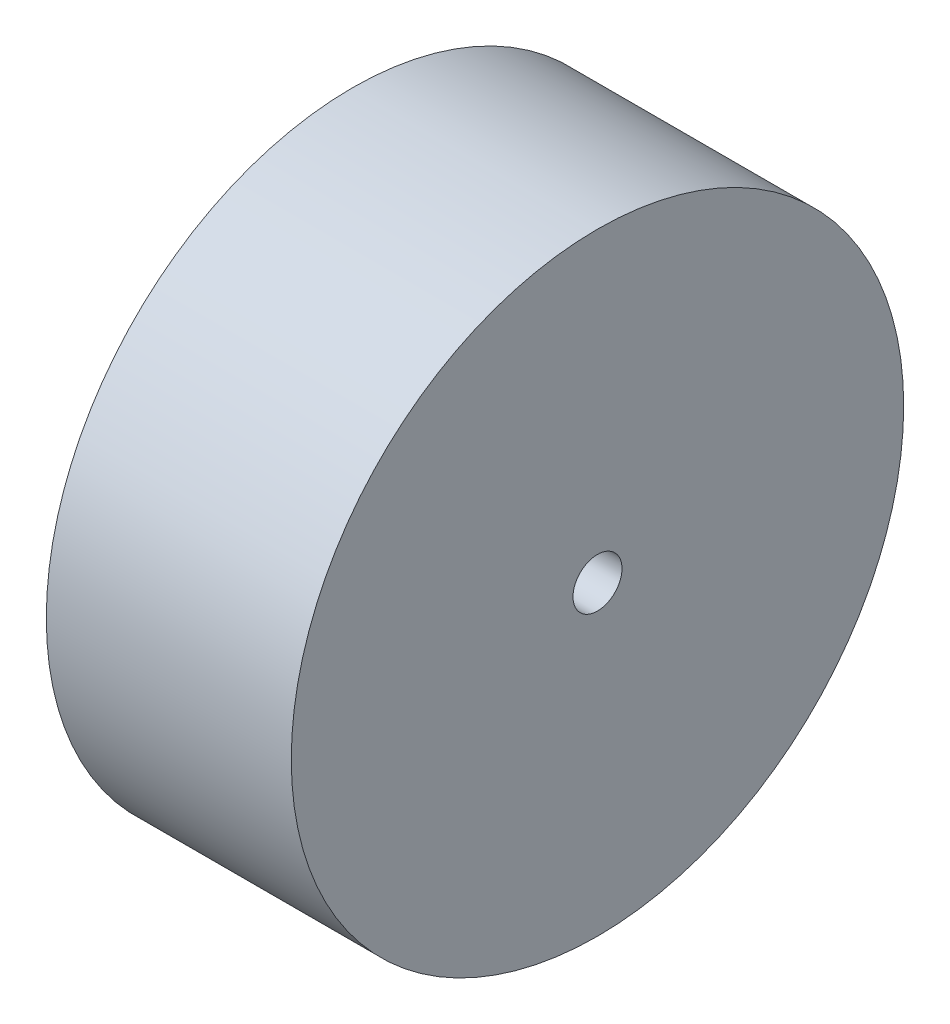
ISO-10303-21;
HEADER;
FILE_DESCRIPTION(('STEP AP214'),'2;1');
FILE_NAME('part.step','',(''),(''),'','','');
FILE_SCHEMA(('AUTOMOTIVE_DESIGN { 1 0 10303 214 1 1 1 1 }'));
ENDSEC;
DATA;
#1=APPLICATION_CONTEXT('core data for automotive mechanical design processes');
#2=APPLICATION_PROTOCOL_DEFINITION('international standard','automotive_design',2000,#1);
#3=PRODUCT_CONTEXT('',#1,'mechanical');
#4=PRODUCT('Part','Part','',(#3));
#5=PRODUCT_RELATED_PRODUCT_CATEGORY('part','',(#4));
#6=PRODUCT_DEFINITION_FORMATION('','',#4);
#7=PRODUCT_DEFINITION_CONTEXT('part definition',#1,'design');
#8=PRODUCT_DEFINITION('design','',#6,#7);
#9=PRODUCT_DEFINITION_SHAPE('','',#8);
#10=(LENGTH_UNIT() NAMED_UNIT(*) SI_UNIT(.MILLI.,.METRE.));
#11=(NAMED_UNIT(*) PLANE_ANGLE_UNIT() SI_UNIT($,.RADIAN.));
#12=(NAMED_UNIT(*) SI_UNIT($,.STERADIAN.) SOLID_ANGLE_UNIT());
#13=UNCERTAINTY_MEASURE_WITH_UNIT(LENGTH_MEASURE(1.E-05),#10,'distance_accuracy_value','');
#14=(GEOMETRIC_REPRESENTATION_CONTEXT(3) GLOBAL_UNCERTAINTY_ASSIGNED_CONTEXT((#13)) GLOBAL_UNIT_ASSIGNED_CONTEXT((#10,
#11,#12)) REPRESENTATION_CONTEXT('',''));
#15=CARTESIAN_POINT('',(0.,0.,0.));
#16=DIRECTION('',(0.,0.,1.));
#17=DIRECTION('',(1.,0.,0.));
#18=AXIS2_PLACEMENT_3D('',#15,#16,#17);
#19=CARTESIAN_POINT('',(50.,0.,0.));
#20=DIRECTION('',(1.,0.,0.));
#21=DIRECTION('',(0.,0.,-1.));
#22=AXIS2_PLACEMENT_3D('',#19,#20,#21);
#23=PLANE('',#22);
#24=CARTESIAN_POINT('',(50.,0.,0.));
#25=DIRECTION('',(1.,0.,0.));
#26=DIRECTION('',(0.,0.,-1.));
#27=AXIS2_PLACEMENT_3D('',#24,#25,#26);
#28=CIRCLE('',#27,62.5);
#29=CARTESIAN_POINT('',(50.,0.,-62.5));
#30=VERTEX_POINT('',#29);
#31=EDGE_CURVE('E10',#30,#30,#28,.T.);
#32=ORIENTED_EDGE('',*,*,#31,.T.);
#33=EDGE_LOOP('',(#32));
#34=FACE_BOUND('',#33,.T.);
#35=CARTESIAN_POINT('',(50.,0.,0.));
#36=DIRECTION('',(1.,0.,0.));
#37=DIRECTION('',(0.,0.,-1.));
#38=AXIS2_PLACEMENT_3D('',#35,#36,#37);
#39=CIRCLE('',#38,5.);
#40=CARTESIAN_POINT('',(50.,0.,-5.));
#41=VERTEX_POINT('',#40);
#42=EDGE_CURVE('E50',#41,#41,#39,.T.);
#43=ORIENTED_EDGE('',*,*,#42,.F.);
#44=EDGE_LOOP('',(#43));
#45=FACE_BOUND('',#44,.T.);
#46=ADVANCED_FACE('F37',(#34,#45),#23,.T.);
#47=CARTESIAN_POINT('',(0.,0.,0.));
#48=DIRECTION('',(1.,0.,0.));
#49=DIRECTION('',(0.,0.,-1.));
#50=AXIS2_PLACEMENT_3D('',#47,#48,#49);
#51=PLANE('',#50);
#52=CARTESIAN_POINT('',(0.,0.,0.));
#53=DIRECTION('',(1.,0.,0.));
#54=DIRECTION('',(0.,0.,-1.));
#55=AXIS2_PLACEMENT_3D('',#52,#53,#54);
#56=CIRCLE('',#55,62.5);
#57=CARTESIAN_POINT('',(0.,0.,-62.5));
#58=VERTEX_POINT('',#57);
#59=EDGE_CURVE('E41',#58,#58,#56,.T.);
#60=ORIENTED_EDGE('',*,*,#59,.F.);
#61=EDGE_LOOP('',(#60));
#62=FACE_BOUND('',#61,.T.);
#63=CARTESIAN_POINT('',(0.,0.,0.));
#64=DIRECTION('',(1.,0.,0.));
#65=DIRECTION('',(0.,0.,-1.));
#66=AXIS2_PLACEMENT_3D('',#63,#64,#65);
#67=CIRCLE('',#66,5.);
#68=CARTESIAN_POINT('',(0.,0.,-5.));
#69=VERTEX_POINT('',#68);
#70=EDGE_CURVE('E52',#69,#69,#67,.T.);
#71=ORIENTED_EDGE('',*,*,#70,.T.);
#72=EDGE_LOOP('',(#71));
#73=FACE_BOUND('',#72,.T.);
#74=ADVANCED_FACE('F64',(#62,#73),#51,.F.);
#75=CARTESIAN_POINT('',(50.,0.,0.));
#76=DIRECTION('',(-1.,0.,0.));
#77=DIRECTION('',(0.,0.,1.));
#78=AXIS2_PLACEMENT_3D('',#75,#76,#77);
#79=CYLINDRICAL_SURFACE('',#78,62.5);
#80=ORIENTED_EDGE('',*,*,#31,.F.);
#81=EDGE_LOOP('',(#80));
#82=FACE_BOUND('',#81,.T.);
#83=ORIENTED_EDGE('',*,*,#59,.T.);
#84=EDGE_LOOP('',(#83));
#85=FACE_BOUND('',#84,.T.);
#86=ADVANCED_FACE('F39',(#82,#85),#79,.T.);
#87=CARTESIAN_POINT('',(50.,0.,0.));
#88=DIRECTION('',(-1.,0.,0.));
#89=DIRECTION('',(0.,0.,1.));
#90=AXIS2_PLACEMENT_3D('',#87,#88,#89);
#91=CYLINDRICAL_SURFACE('',#90,5.);
#92=ORIENTED_EDGE('',*,*,#42,.T.);
#93=EDGE_LOOP('',(#92));
#94=FACE_BOUND('',#93,.T.);
#95=ORIENTED_EDGE('',*,*,#70,.F.);
#96=EDGE_LOOP('',(#95));
#97=FACE_BOUND('',#96,.T.);
#98=ADVANCED_FACE('F60',(#94,#97),#91,.F.);
#99=CLOSED_SHELL('',(#46,#74,#86,#98));
#100=MANIFOLD_SOLID_BREP('B2',#99);
#101=ADVANCED_BREP_SHAPE_REPRESENTATION('',(#18,#100),#14);
#102=SHAPE_DEFINITION_REPRESENTATION(#9,#101);
ENDSEC;
END-ISO-10303-21;
